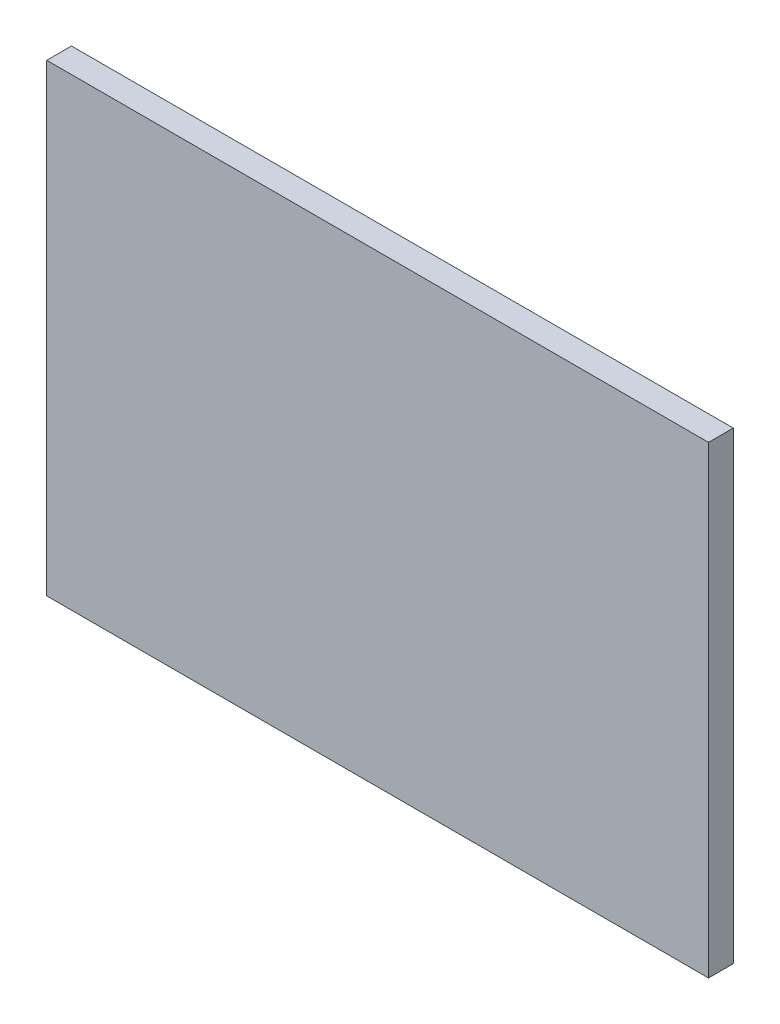
ISO-10303-21;
HEADER;
FILE_DESCRIPTION(('STEP AP214'),'2;1');
FILE_NAME('part.step','',(''),(''),'','','');
FILE_SCHEMA(('AUTOMOTIVE_DESIGN { 1 0 10303 214 1 1 1 1 }'));
ENDSEC;
DATA;
#1=APPLICATION_CONTEXT('core data for automotive mechanical design processes');
#2=APPLICATION_PROTOCOL_DEFINITION('international standard','automotive_design',2000,#1);
#3=PRODUCT_CONTEXT('',#1,'mechanical');
#4=PRODUCT('Part','Part','',(#3));
#5=PRODUCT_RELATED_PRODUCT_CATEGORY('part','',(#4));
#6=PRODUCT_DEFINITION_FORMATION('','',#4);
#7=PRODUCT_DEFINITION_CONTEXT('part definition',#1,'design');
#8=PRODUCT_DEFINITION('design','',#6,#7);
#9=PRODUCT_DEFINITION_SHAPE('','',#8);
#10=(LENGTH_UNIT() NAMED_UNIT(*) SI_UNIT(.MILLI.,.METRE.));
#11=(NAMED_UNIT(*) PLANE_ANGLE_UNIT() SI_UNIT($,.RADIAN.));
#12=(NAMED_UNIT(*) SI_UNIT($,.STERADIAN.) SOLID_ANGLE_UNIT());
#13=UNCERTAINTY_MEASURE_WITH_UNIT(LENGTH_MEASURE(1.E-05),#10,'distance_accuracy_value','');
#14=(GEOMETRIC_REPRESENTATION_CONTEXT(3) GLOBAL_UNCERTAINTY_ASSIGNED_CONTEXT((#13)) GLOBAL_UNIT_ASSIGNED_CONTEXT((#10,
#11,#12)) REPRESENTATION_CONTEXT('',''));
#15=CARTESIAN_POINT('',(0.,0.,0.));
#16=DIRECTION('',(0.,0.,1.));
#17=DIRECTION('',(1.,0.,0.));
#18=AXIS2_PLACEMENT_3D('',#15,#16,#17);
#19=CARTESIAN_POINT('',(1605.,-1125.,60.));
#20=DIRECTION('',(-1.,0.,0.));
#21=DIRECTION('',(0.,0.,1.));
#22=AXIS2_PLACEMENT_3D('',#19,#20,#21);
#23=PLANE('',#22);
#24=DIRECTION('',(0.,1.,0.));
#25=VECTOR('',#24,1.);
#26=CARTESIAN_POINT('',(1605.,-1125.,-60.));
#27=LINE('',#26,#25);
#28=CARTESIAN_POINT('',(1605.,-1125.,-60.));
#29=VERTEX_POINT('',#28);
#30=CARTESIAN_POINT('',(1605.,1125.,-60.));
#31=VERTEX_POINT('',#30);
#32=EDGE_CURVE('E97',#29,#31,#27,.T.);
#33=ORIENTED_EDGE('',*,*,#32,.T.);
#34=DIRECTION('',(0.,0.,-1.));
#35=VECTOR('',#34,1.);
#36=CARTESIAN_POINT('',(1605.,1125.,60.));
#37=LINE('',#36,#35);
#38=CARTESIAN_POINT('',(1605.,1125.,60.));
#39=VERTEX_POINT('',#38);
#40=EDGE_CURVE('E11',#39,#31,#37,.T.);
#41=ORIENTED_EDGE('',*,*,#40,.F.);
#42=DIRECTION('',(0.,1.,0.));
#43=VECTOR('',#42,1.);
#44=CARTESIAN_POINT('',(1605.,-1125.,60.));
#45=LINE('',#44,#43);
#46=CARTESIAN_POINT('',(1605.,-1125.,60.));
#47=VERTEX_POINT('',#46);
#48=EDGE_CURVE('E85',#47,#39,#45,.T.);
#49=ORIENTED_EDGE('',*,*,#48,.F.);
#50=DIRECTION('',(0.,0.,-1.));
#51=VECTOR('',#50,1.);
#52=CARTESIAN_POINT('',(1605.,-1125.,60.));
#53=LINE('',#52,#51);
#54=EDGE_CURVE('E93',#47,#29,#53,.T.);
#55=ORIENTED_EDGE('',*,*,#54,.T.);
#56=EDGE_LOOP('',(#33,#41,#49,#55));
#57=FACE_BOUND('',#56,.T.);
#58=ADVANCED_FACE('F34',(#57),#23,.F.);
#59=CARTESIAN_POINT('',(-1605.,1125.,60.));
#60=DIRECTION('',(0.,-1.,0.));
#61=DIRECTION('',(0.,0.,-1.));
#62=AXIS2_PLACEMENT_3D('',#59,#60,#61);
#63=PLANE('',#62);
#64=DIRECTION('',(-1.,0.,0.));
#65=VECTOR('',#64,1.);
#66=CARTESIAN_POINT('',(-1605.,1125.,-60.));
#67=LINE('',#66,#65);
#68=CARTESIAN_POINT('',(-1605.,1125.,-60.));
#69=VERTEX_POINT('',#68);
#70=EDGE_CURVE('E89',#31,#69,#67,.T.);
#71=ORIENTED_EDGE('',*,*,#70,.T.);
#72=DIRECTION('',(0.,0.,-1.));
#73=VECTOR('',#72,1.);
#74=CARTESIAN_POINT('',(-1605.,1125.,60.));
#75=LINE('',#74,#73);
#76=CARTESIAN_POINT('',(-1605.,1125.,60.));
#77=VERTEX_POINT('',#76);
#78=EDGE_CURVE('E42',#77,#69,#75,.T.);
#79=ORIENTED_EDGE('',*,*,#78,.F.);
#80=DIRECTION('',(-1.,0.,0.));
#81=VECTOR('',#80,1.);
#82=CARTESIAN_POINT('',(-1605.,1125.,60.));
#83=LINE('',#82,#81);
#84=EDGE_CURVE('E80',#39,#77,#83,.T.);
#85=ORIENTED_EDGE('',*,*,#84,.F.);
#86=ORIENTED_EDGE('',*,*,#40,.T.);
#87=EDGE_LOOP('',(#71,#79,#85,#86));
#88=FACE_BOUND('',#87,.T.);
#89=ADVANCED_FACE('F88',(#88),#63,.F.);
#90=CARTESIAN_POINT('',(-1605.,-1125.,60.));
#91=DIRECTION('',(1.,0.,0.));
#92=DIRECTION('',(0.,0.,-1.));
#93=AXIS2_PLACEMENT_3D('',#90,#91,#92);
#94=PLANE('',#93);
#95=DIRECTION('',(0.,-1.,0.));
#96=VECTOR('',#95,1.);
#97=CARTESIAN_POINT('',(-1605.,-1125.,-60.));
#98=LINE('',#97,#96);
#99=CARTESIAN_POINT('',(-1605.,-1125.,-60.));
#100=VERTEX_POINT('',#99);
#101=EDGE_CURVE('E67',#69,#100,#98,.T.);
#102=ORIENTED_EDGE('',*,*,#101,.T.);
#103=DIRECTION('',(0.,0.,-1.));
#104=VECTOR('',#103,1.);
#105=CARTESIAN_POINT('',(-1605.,-1125.,60.));
#106=LINE('',#105,#104);
#107=CARTESIAN_POINT('',(-1605.,-1125.,60.));
#108=VERTEX_POINT('',#107);
#109=EDGE_CURVE('E90',#108,#100,#106,.T.);
#110=ORIENTED_EDGE('',*,*,#109,.F.);
#111=DIRECTION('',(0.,-1.,0.));
#112=VECTOR('',#111,1.);
#113=CARTESIAN_POINT('',(-1605.,-1125.,60.));
#114=LINE('',#113,#112);
#115=EDGE_CURVE('E83',#77,#108,#114,.T.);
#116=ORIENTED_EDGE('',*,*,#115,.F.);
#117=ORIENTED_EDGE('',*,*,#78,.T.);
#118=EDGE_LOOP('',(#102,#110,#116,#117));
#119=FACE_BOUND('',#118,.T.);
#120=ADVANCED_FACE('F91',(#119),#94,.F.);
#121=CARTESIAN_POINT('',(-1605.,-1125.,60.));
#122=DIRECTION('',(0.,1.,0.));
#123=DIRECTION('',(0.,0.,1.));
#124=AXIS2_PLACEMENT_3D('',#121,#122,#123);
#125=PLANE('',#124);
#126=DIRECTION('',(1.,0.,0.));
#127=VECTOR('',#126,1.);
#128=CARTESIAN_POINT('',(-1605.,-1125.,-60.));
#129=LINE('',#128,#127);
#130=EDGE_CURVE('E73',#100,#29,#129,.T.);
#131=ORIENTED_EDGE('',*,*,#130,.T.);
#132=ORIENTED_EDGE('',*,*,#54,.F.);
#133=DIRECTION('',(1.,0.,0.));
#134=VECTOR('',#133,1.);
#135=CARTESIAN_POINT('',(-1605.,-1125.,60.));
#136=LINE('',#135,#134);
#137=EDGE_CURVE('E50',#108,#47,#136,.T.);
#138=ORIENTED_EDGE('',*,*,#137,.F.);
#139=ORIENTED_EDGE('',*,*,#109,.T.);
#140=EDGE_LOOP('',(#131,#132,#138,#139));
#141=FACE_BOUND('',#140,.T.);
#142=ADVANCED_FACE('F104',(#141),#125,.F.);
#143=CARTESIAN_POINT('',(0.,0.,60.));
#144=DIRECTION('',(0.,0.,-1.));
#145=DIRECTION('',(-1.,0.,0.));
#146=AXIS2_PLACEMENT_3D('',#143,#144,#145);
#147=PLANE('',#146);
#148=ORIENTED_EDGE('',*,*,#48,.T.);
#149=ORIENTED_EDGE('',*,*,#84,.T.);
#150=ORIENTED_EDGE('',*,*,#115,.T.);
#151=ORIENTED_EDGE('',*,*,#137,.T.);
#152=EDGE_LOOP('',(#148,#149,#150,#151));
#153=FACE_BOUND('',#152,.T.);
#154=ADVANCED_FACE('F81',(#153),#147,.F.);
#155=CARTESIAN_POINT('',(0.,0.,-60.));
#156=DIRECTION('',(0.,0.,-1.));
#157=DIRECTION('',(-1.,0.,0.));
#158=AXIS2_PLACEMENT_3D('',#155,#156,#157);
#159=PLANE('',#158);
#160=ORIENTED_EDGE('',*,*,#32,.F.);
#161=ORIENTED_EDGE('',*,*,#130,.F.);
#162=ORIENTED_EDGE('',*,*,#101,.F.);
#163=ORIENTED_EDGE('',*,*,#70,.F.);
#164=EDGE_LOOP('',(#160,#161,#162,#163));
#165=FACE_BOUND('',#164,.T.);
#166=ADVANCED_FACE('F107',(#165),#159,.T.);
#167=CLOSED_SHELL('',(#58,#89,#120,#142,#154,#166));
#168=MANIFOLD_SOLID_BREP('B2',#167);
#169=ADVANCED_BREP_SHAPE_REPRESENTATION('',(#18,#168),#14);
#170=SHAPE_DEFINITION_REPRESENTATION(#9,#169);
ENDSEC;
END-ISO-10303-21;
